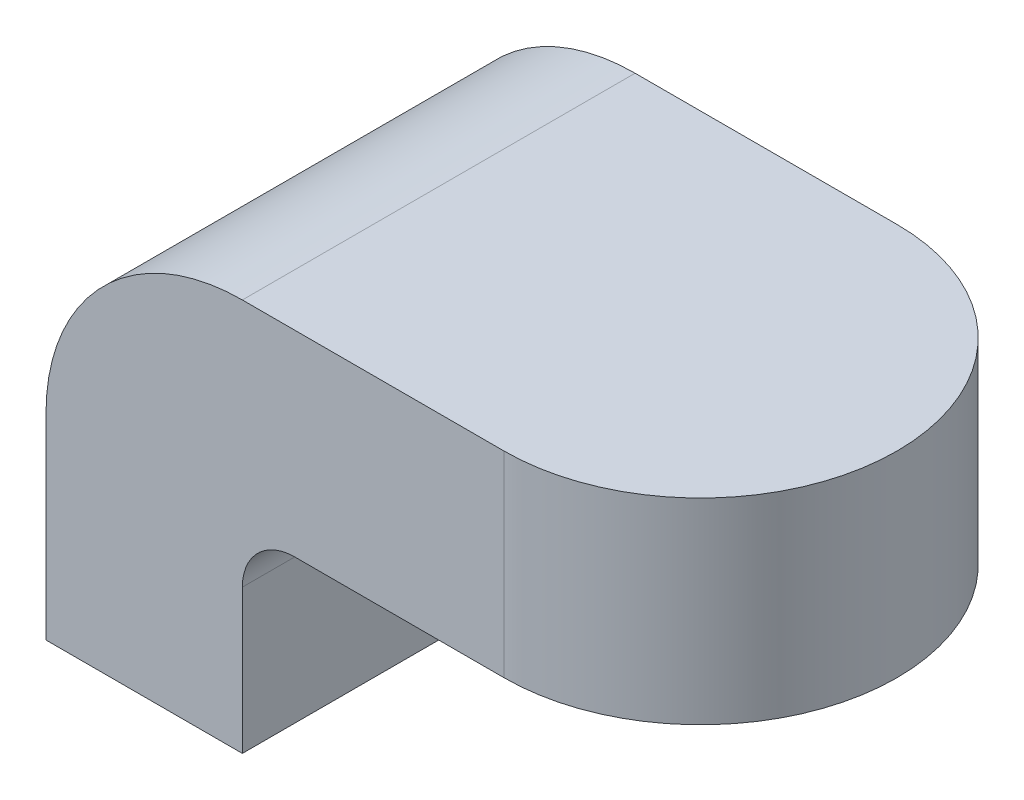
ISO-10303-21;
HEADER;
FILE_DESCRIPTION(('STEP AP214'),'2;1');
FILE_NAME('part.step','',(''),(''),'','','');
FILE_SCHEMA(('AUTOMOTIVE_DESIGN { 1 0 10303 214 1 1 1 1 }'));
ENDSEC;
DATA;
#1=APPLICATION_CONTEXT('core data for automotive mechanical design processes');
#2=APPLICATION_PROTOCOL_DEFINITION('international standard','automotive_design',2000,#1);
#3=PRODUCT_CONTEXT('',#1,'mechanical');
#4=PRODUCT('Part','Part','',(#3));
#5=PRODUCT_RELATED_PRODUCT_CATEGORY('part','',(#4));
#6=PRODUCT_DEFINITION_FORMATION('','',#4);
#7=PRODUCT_DEFINITION_CONTEXT('part definition',#1,'design');
#8=PRODUCT_DEFINITION('design','',#6,#7);
#9=PRODUCT_DEFINITION_SHAPE('','',#8);
#10=(LENGTH_UNIT() NAMED_UNIT(*) SI_UNIT(.MILLI.,.METRE.));
#11=(NAMED_UNIT(*) PLANE_ANGLE_UNIT() SI_UNIT($,.RADIAN.));
#12=(NAMED_UNIT(*) SI_UNIT($,.STERADIAN.) SOLID_ANGLE_UNIT());
#13=UNCERTAINTY_MEASURE_WITH_UNIT(LENGTH_MEASURE(1.E-05),#10,'distance_accuracy_value','');
#14=(GEOMETRIC_REPRESENTATION_CONTEXT(3) GLOBAL_UNCERTAINTY_ASSIGNED_CONTEXT((#13)) GLOBAL_UNIT_ASSIGNED_CONTEXT((#10,
#11,#12)) REPRESENTATION_CONTEXT('',''));
#15=CARTESIAN_POINT('',(0.,0.,0.));
#16=DIRECTION('',(0.,0.,1.));
#17=DIRECTION('',(1.,0.,0.));
#18=AXIS2_PLACEMENT_3D('',#15,#16,#17);
#19=CARTESIAN_POINT('',(-277.8665267148,204.2245766,17.15));
#20=DIRECTION('',(0.,1.,0.));
#21=DIRECTION('',(-1.,0.,0.));
#22=AXIS2_PLACEMENT_3D('',#19,#20,#21);
#23=CYLINDRICAL_SURFACE('',#22,1.5);
#24=CARTESIAN_POINT('',(-277.8665267148,206.024579,17.15));
#25=DIRECTION('',(0.,-1.,0.));
#26=DIRECTION('',(0.,0.,-1.));
#27=AXIS2_PLACEMENT_3D('',#24,#25,#26);
#28=CIRCLE('',#27,1.5);
#29=CARTESIAN_POINT('',(-277.8665267148,206.024579,15.65));
#30=VERTEX_POINT('',#29);
#31=CARTESIAN_POINT('',(-276.3665267148,206.024579,17.15));
#32=VERTEX_POINT('',#31);
#33=EDGE_CURVE('E25',#30,#32,#28,.T.);
#34=ORIENTED_EDGE('',*,*,#33,.F.);
#35=DIRECTION('',(0.,1.,0.));
#36=VECTOR('',#35,1.);
#37=CARTESIAN_POINT('',(-277.8665267148,206.024579,15.65));
#38=LINE('',#37,#36);
#39=CARTESIAN_POINT('',(-277.8665267148,207.524579,15.65));
#40=VERTEX_POINT('',#39);
#41=EDGE_CURVE('E74',#30,#40,#38,.T.);
#42=ORIENTED_EDGE('',*,*,#41,.T.);
#43=CARTESIAN_POINT('',(-277.8665267148,207.524579,17.15));
#44=DIRECTION('',(0.,1.,0.));
#45=DIRECTION('',(0.,0.,1.));
#46=AXIS2_PLACEMENT_3D('',#43,#44,#45);
#47=CIRCLE('',#46,1.5);
#48=CARTESIAN_POINT('',(-277.8665267148,207.524579,18.65));
#49=VERTEX_POINT('',#48);
#50=EDGE_CURVE('E159',#49,#40,#47,.T.);
#51=ORIENTED_EDGE('',*,*,#50,.F.);
#52=DIRECTION('',(0.,-1.,0.));
#53=VECTOR('',#52,1.);
#54=CARTESIAN_POINT('',(-277.8665267148,207.524579,18.65));
#55=LINE('',#54,#53);
#56=CARTESIAN_POINT('',(-277.8665267148,206.024579,18.65));
#57=VERTEX_POINT('',#56);
#58=EDGE_CURVE('E138',#49,#57,#55,.T.);
#59=ORIENTED_EDGE('',*,*,#58,.T.);
#60=CARTESIAN_POINT('',(-277.8665267148,206.024579,17.15));
#61=DIRECTION('',(0.,-1.,0.));
#62=DIRECTION('',(1.,0.,0.));
#63=AXIS2_PLACEMENT_3D('',#60,#61,#62);
#64=CIRCLE('',#63,1.5);
#65=EDGE_CURVE('E11',#32,#57,#64,.T.);
#66=ORIENTED_EDGE('',*,*,#65,.F.);
#67=EDGE_LOOP('',(#34,#42,#51,#59,#66));
#68=FACE_BOUND('',#67,.T.);
#69=ADVANCED_FACE('F17',(#68),#23,.T.);
#70=CARTESIAN_POINT('',(-279.8665267148,206.024579,15.65));
#71=DIRECTION('',(0.,-1.,0.));
#72=DIRECTION('',(0.,0.,-1.));
#73=AXIS2_PLACEMENT_3D('',#70,#71,#72);
#74=PLANE('',#73);
#75=DIRECTION('',(-1.,0.,0.));
#76=VECTOR('',#75,1.);
#77=CARTESIAN_POINT('',(-277.8665267148,206.024579,15.65));
#78=LINE('',#77,#76);
#79=CARTESIAN_POINT('',(-279.4665267148,206.024579,15.65));
#80=VERTEX_POINT('',#79);
#81=EDGE_CURVE('E168',#30,#80,#78,.T.);
#82=ORIENTED_EDGE('',*,*,#81,.F.);
#83=ORIENTED_EDGE('',*,*,#33,.T.);
#84=ORIENTED_EDGE('',*,*,#65,.T.);
#85=DIRECTION('',(-1.,0.,0.));
#86=VECTOR('',#85,1.);
#87=CARTESIAN_POINT('',(-277.8665267148,206.024579,18.65));
#88=LINE('',#87,#86);
#89=CARTESIAN_POINT('',(-279.4665267148,206.024579,18.65));
#90=VERTEX_POINT('',#89);
#91=EDGE_CURVE('E148',#57,#90,#88,.T.);
#92=ORIENTED_EDGE('',*,*,#91,.T.);
#93=DIRECTION('',(0.,0.,1.));
#94=VECTOR('',#93,1.);
#95=CARTESIAN_POINT('',(-279.4665267148,206.024579,15.65));
#96=LINE('',#95,#94);
#97=EDGE_CURVE('E179',#80,#90,#96,.T.);
#98=ORIENTED_EDGE('',*,*,#97,.F.);
#99=EDGE_LOOP('',(#82,#83,#84,#92,#98));
#100=FACE_BOUND('',#99,.T.);
#101=ADVANCED_FACE('F185',(#100),#74,.T.);
#102=CARTESIAN_POINT('',(-279.4665267148,205.624579,17.45202915288));
#103=DIRECTION('',(0.,0.,-1.));
#104=DIRECTION('',(1.,0.,0.));
#105=AXIS2_PLACEMENT_3D('',#102,#103,#104);
#106=CYLINDRICAL_SURFACE('',#105,0.4);
#107=CARTESIAN_POINT('',(-279.4665267148,205.624579,15.65));
#108=DIRECTION('',(0.,0.,1.));
#109=DIRECTION('',(-7.105427357601E-13,1.,0.));
#110=AXIS2_PLACEMENT_3D('',#107,#108,#109);
#111=CIRCLE('',#110,0.4);
#112=CARTESIAN_POINT('',(-279.8665267148,205.624579,15.65));
#113=VERTEX_POINT('',#112);
#114=EDGE_CURVE('E172',#80,#113,#111,.T.);
#115=ORIENTED_EDGE('',*,*,#114,.F.);
#116=ORIENTED_EDGE('',*,*,#97,.T.);
#117=CARTESIAN_POINT('',(-279.4665267148,205.624579,18.65));
#118=DIRECTION('',(0.,0.,-1.));
#119=DIRECTION('',(-1.,-1.42108547152E-12,0.));
#120=AXIS2_PLACEMENT_3D('',#117,#118,#119);
#121=CIRCLE('',#120,0.4);
#122=CARTESIAN_POINT('',(-279.8665267148,205.624579,18.65));
#123=VERTEX_POINT('',#122);
#124=EDGE_CURVE('E141',#123,#90,#121,.T.);
#125=ORIENTED_EDGE('',*,*,#124,.F.);
#126=DIRECTION('',(0.,0.,-1.));
#127=VECTOR('',#126,1.);
#128=CARTESIAN_POINT('',(-279.8665267148,205.624579,18.65));
#129=LINE('',#128,#127);
#130=EDGE_CURVE('E39',#123,#113,#129,.T.);
#131=ORIENTED_EDGE('',*,*,#130,.T.);
#132=EDGE_LOOP('',(#115,#116,#125,#131));
#133=FACE_BOUND('',#132,.T.);
#134=ADVANCED_FACE('F194',(#133),#106,.F.);
#135=CARTESIAN_POINT('',(-279.8665267148,204.524579,15.65));
#136=DIRECTION('',(1.,0.,0.));
#137=DIRECTION('',(0.,1.,0.));
#138=AXIS2_PLACEMENT_3D('',#135,#136,#137);
#139=PLANE('',#138);
#140=DIRECTION('',(0.,-1.,0.));
#141=VECTOR('',#140,1.);
#142=CARTESIAN_POINT('',(-279.8665267148,205.624579,18.65));
#143=LINE('',#142,#141);
#144=CARTESIAN_POINT('',(-279.8665267148,204.524579,18.65));
#145=VERTEX_POINT('',#144);
#146=EDGE_CURVE('E132',#123,#145,#143,.T.);
#147=ORIENTED_EDGE('',*,*,#146,.T.);
#148=DIRECTION('',(0.,0.,1.));
#149=VECTOR('',#148,1.);
#150=CARTESIAN_POINT('',(-279.8665267148,204.524579,15.65));
#151=LINE('',#150,#149);
#152=CARTESIAN_POINT('',(-279.8665267148,204.524579,15.65));
#153=VERTEX_POINT('',#152);
#154=EDGE_CURVE('E104',#153,#145,#151,.T.);
#155=ORIENTED_EDGE('',*,*,#154,.F.);
#156=DIRECTION('',(0.,-1.,0.));
#157=VECTOR('',#156,1.);
#158=CARTESIAN_POINT('',(-279.8665267148,205.624579,15.65));
#159=LINE('',#158,#157);
#160=EDGE_CURVE('E99',#113,#153,#159,.T.);
#161=ORIENTED_EDGE('',*,*,#160,.F.);
#162=ORIENTED_EDGE('',*,*,#130,.F.);
#163=EDGE_LOOP('',(#147,#155,#161,#162));
#164=FACE_BOUND('',#163,.T.);
#165=ADVANCED_FACE('F196',(#164),#139,.T.);
#166=CARTESIAN_POINT('',(-281.3665267148,204.524579,15.65));
#167=DIRECTION('',(0.,0.,-1.));
#168=DIRECTION('',(0.,-1.,0.));
#169=AXIS2_PLACEMENT_3D('',#166,#167,#168);
#170=PLANE('',#169);
#171=DIRECTION('',(0.,-1.,0.));
#172=VECTOR('',#171,1.);
#173=CARTESIAN_POINT('',(-281.3665267148,206.024579,15.65));
#174=LINE('',#173,#172);
#175=CARTESIAN_POINT('',(-281.3665267148,206.024579,15.65));
#176=VERTEX_POINT('',#175);
#177=CARTESIAN_POINT('',(-281.3665267148,204.524579,15.65));
#178=VERTEX_POINT('',#177);
#179=EDGE_CURVE('E96',#176,#178,#174,.T.);
#180=ORIENTED_EDGE('',*,*,#179,.F.);
#181=CARTESIAN_POINT('',(-279.8665267148,206.024579,15.65));
#182=DIRECTION('',(0.,0.,-1.));
#183=DIRECTION('',(-1.,0.,0.));
#184=AXIS2_PLACEMENT_3D('',#181,#182,#183);
#185=CIRCLE('',#184,1.5);
#186=CARTESIAN_POINT('',(-279.8665267148,207.524579,15.65));
#187=VERTEX_POINT('',#186);
#188=EDGE_CURVE('E87',#176,#187,#185,.T.);
#189=ORIENTED_EDGE('',*,*,#188,.T.);
#190=DIRECTION('',(1.,0.,0.));
#191=VECTOR('',#190,1.);
#192=CARTESIAN_POINT('',(-279.8665267148,207.524579,15.65));
#193=LINE('',#192,#191);
#194=EDGE_CURVE('E163',#187,#40,#193,.T.);
#195=ORIENTED_EDGE('',*,*,#194,.T.);
#196=ORIENTED_EDGE('',*,*,#41,.F.);
#197=ORIENTED_EDGE('',*,*,#81,.T.);
#198=ORIENTED_EDGE('',*,*,#114,.T.);
#199=ORIENTED_EDGE('',*,*,#160,.T.);
#200=DIRECTION('',(1.,0.,0.));
#201=VECTOR('',#200,1.);
#202=CARTESIAN_POINT('',(-281.3665267148,204.524579,15.65));
#203=LINE('',#202,#201);
#204=EDGE_CURVE('E92',#178,#153,#203,.T.);
#205=ORIENTED_EDGE('',*,*,#204,.F.);
#206=EDGE_LOOP('',(#180,#189,#195,#196,#197,#198,#199,#205));
#207=FACE_BOUND('',#206,.T.);
#208=ADVANCED_FACE('F94',(#207),#170,.T.);
#209=CARTESIAN_POINT('',(-282.7289243486,207.524579,17.45202915288));
#210=DIRECTION('',(0.,1.,0.));
#211=DIRECTION('',(1.,0.,0.));
#212=AXIS2_PLACEMENT_3D('',#209,#210,#211);
#213=PLANE('',#212);
#214=DIRECTION('',(-1.,0.,0.));
#215=VECTOR('',#214,1.);
#216=CARTESIAN_POINT('',(-277.8665267148,207.524579,18.65));
#217=LINE('',#216,#215);
#218=CARTESIAN_POINT('',(-279.8665267148,207.524579,18.65));
#219=VERTEX_POINT('',#218);
#220=EDGE_CURVE('E133',#49,#219,#217,.T.);
#221=ORIENTED_EDGE('',*,*,#220,.F.);
#222=ORIENTED_EDGE('',*,*,#50,.T.);
#223=ORIENTED_EDGE('',*,*,#194,.F.);
#224=DIRECTION('',(0.,0.,-1.));
#225=VECTOR('',#224,1.);
#226=CARTESIAN_POINT('',(-279.8665267148,207.524579,18.65));
#227=LINE('',#226,#225);
#228=EDGE_CURVE('E156',#219,#187,#227,.T.);
#229=ORIENTED_EDGE('',*,*,#228,.F.);
#230=EDGE_LOOP('',(#221,#222,#223,#229));
#231=FACE_BOUND('',#230,.T.);
#232=ADVANCED_FACE('F188',(#231),#213,.T.);
#233=CARTESIAN_POINT('',(-279.8665267148,206.024579,17.45202915288));
#234=DIRECTION('',(0.,0.,1.));
#235=DIRECTION('',(-1.,0.,0.));
#236=AXIS2_PLACEMENT_3D('',#233,#234,#235);
#237=CYLINDRICAL_SURFACE('',#236,1.5);
#238=ORIENTED_EDGE('',*,*,#188,.F.);
#239=DIRECTION('',(0.,0.,1.));
#240=VECTOR('',#239,1.);
#241=CARTESIAN_POINT('',(-281.3665267148,206.024579,15.65));
#242=LINE('',#241,#240);
#243=CARTESIAN_POINT('',(-281.3665267148,206.024579,18.65));
#244=VERTEX_POINT('',#243);
#245=EDGE_CURVE('E117',#176,#244,#242,.T.);
#246=ORIENTED_EDGE('',*,*,#245,.T.);
#247=CARTESIAN_POINT('',(-279.8665267148,206.024579,18.65));
#248=DIRECTION('',(0.,0.,1.));
#249=DIRECTION('',(0.,1.,0.));
#250=AXIS2_PLACEMENT_3D('',#247,#248,#249);
#251=CIRCLE('',#250,1.5);
#252=EDGE_CURVE('E137',#219,#244,#251,.T.);
#253=ORIENTED_EDGE('',*,*,#252,.F.);
#254=ORIENTED_EDGE('',*,*,#228,.T.);
#255=EDGE_LOOP('',(#238,#246,#253,#254));
#256=FACE_BOUND('',#255,.T.);
#257=ADVANCED_FACE('F245',(#256),#237,.T.);
#258=CARTESIAN_POINT('',(-279.8665267148,204.524579,18.65));
#259=DIRECTION('',(0.,0.,1.));
#260=DIRECTION('',(1.,0.,0.));
#261=AXIS2_PLACEMENT_3D('',#258,#259,#260);
#262=PLANE('',#261);
#263=ORIENTED_EDGE('',*,*,#146,.F.);
#264=ORIENTED_EDGE('',*,*,#124,.T.);
#265=ORIENTED_EDGE('',*,*,#91,.F.);
#266=ORIENTED_EDGE('',*,*,#58,.F.);
#267=ORIENTED_EDGE('',*,*,#220,.T.);
#268=ORIENTED_EDGE('',*,*,#252,.T.);
#269=DIRECTION('',(0.,-1.,0.));
#270=VECTOR('',#269,1.);
#271=CARTESIAN_POINT('',(-281.3665267148,206.024579,18.65));
#272=LINE('',#271,#270);
#273=CARTESIAN_POINT('',(-281.3665267148,204.524579,18.65));
#274=VERTEX_POINT('',#273);
#275=EDGE_CURVE('E124',#244,#274,#272,.T.);
#276=ORIENTED_EDGE('',*,*,#275,.T.);
#277=DIRECTION('',(-1.,0.,0.));
#278=VECTOR('',#277,1.);
#279=CARTESIAN_POINT('',(-279.8665267148,204.524579,18.65));
#280=LINE('',#279,#278);
#281=EDGE_CURVE('E110',#145,#274,#280,.T.);
#282=ORIENTED_EDGE('',*,*,#281,.F.);
#283=EDGE_LOOP('',(#263,#264,#265,#266,#267,#268,#276,#282));
#284=FACE_BOUND('',#283,.T.);
#285=ADVANCED_FACE('F193',(#284),#262,.T.);
#286=CARTESIAN_POINT('',(-282.7289243486,204.524579,17.45202915288));
#287=DIRECTION('',(0.,1.,0.));
#288=DIRECTION('',(1.,0.,0.));
#289=AXIS2_PLACEMENT_3D('',#286,#287,#288);
#290=PLANE('',#289);
#291=ORIENTED_EDGE('',*,*,#204,.T.);
#292=ORIENTED_EDGE('',*,*,#154,.T.);
#293=ORIENTED_EDGE('',*,*,#281,.T.);
#294=DIRECTION('',(0.,0.,-1.));
#295=VECTOR('',#294,1.);
#296=CARTESIAN_POINT('',(-281.3665267148,204.524579,18.65));
#297=LINE('',#296,#295);
#298=EDGE_CURVE('E105',#274,#178,#297,.T.);
#299=ORIENTED_EDGE('',*,*,#298,.T.);
#300=EDGE_LOOP('',(#291,#292,#293,#299));
#301=FACE_BOUND('',#300,.T.);
#302=ADVANCED_FACE('F108',(#301),#290,.F.);
#303=CARTESIAN_POINT('',(-281.3665267148,204.524579,18.65));
#304=DIRECTION('',(-1.,0.,0.));
#305=DIRECTION('',(0.,0.,1.));
#306=AXIS2_PLACEMENT_3D('',#303,#304,#305);
#307=PLANE('',#306);
#308=ORIENTED_EDGE('',*,*,#275,.F.);
#309=ORIENTED_EDGE('',*,*,#245,.F.);
#310=ORIENTED_EDGE('',*,*,#179,.T.);
#311=ORIENTED_EDGE('',*,*,#298,.F.);
#312=EDGE_LOOP('',(#308,#309,#310,#311));
#313=FACE_BOUND('',#312,.T.);
#314=ADVANCED_FACE('F116',(#313),#307,.T.);
#315=CLOSED_SHELL('',(#69,#101,#134,#165,#208,#232,#257,#285,#302,#314));
#316=MANIFOLD_SOLID_BREP('B1',#315);
#317=ADVANCED_BREP_SHAPE_REPRESENTATION('',(#18,#316),#14);
#318=SHAPE_DEFINITION_REPRESENTATION(#9,#317);
ENDSEC;
END-ISO-10303-21;
